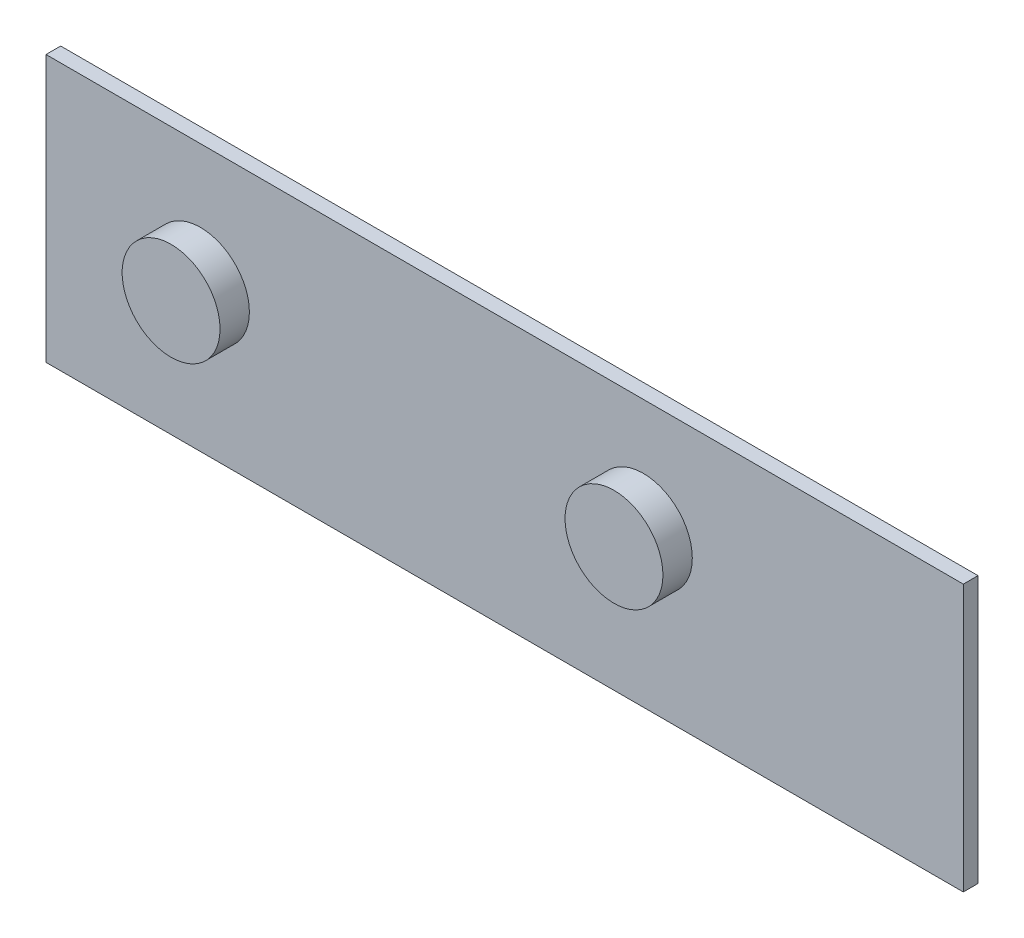
ISO-10303-21;
HEADER;
FILE_DESCRIPTION(('STEP AP214'),'2;1');
FILE_NAME('part.step','',(''),(''),'','','');
FILE_SCHEMA(('AUTOMOTIVE_DESIGN { 1 0 10303 214 1 1 1 1 }'));
ENDSEC;
DATA;
#1=APPLICATION_CONTEXT('core data for automotive mechanical design processes');
#2=APPLICATION_PROTOCOL_DEFINITION('international standard','automotive_design',2000,#1);
#3=PRODUCT_CONTEXT('',#1,'mechanical');
#4=PRODUCT('Part','Part','',(#3));
#5=PRODUCT_RELATED_PRODUCT_CATEGORY('part','',(#4));
#6=PRODUCT_DEFINITION_FORMATION('','',#4);
#7=PRODUCT_DEFINITION_CONTEXT('part definition',#1,'design');
#8=PRODUCT_DEFINITION('design','',#6,#7);
#9=PRODUCT_DEFINITION_SHAPE('','',#8);
#10=(LENGTH_UNIT() NAMED_UNIT(*) SI_UNIT(.MILLI.,.METRE.));
#11=(NAMED_UNIT(*) PLANE_ANGLE_UNIT() SI_UNIT($,.RADIAN.));
#12=(NAMED_UNIT(*) SI_UNIT($,.STERADIAN.) SOLID_ANGLE_UNIT());
#13=UNCERTAINTY_MEASURE_WITH_UNIT(LENGTH_MEASURE(1.E-05),#10,'distance_accuracy_value','');
#14=(GEOMETRIC_REPRESENTATION_CONTEXT(3) GLOBAL_UNCERTAINTY_ASSIGNED_CONTEXT((#13)) GLOBAL_UNIT_ASSIGNED_CONTEXT((#10,
#11,#12)) REPRESENTATION_CONTEXT('',''));
#15=CARTESIAN_POINT('',(0.,0.,0.));
#16=DIRECTION('',(0.,0.,1.));
#17=DIRECTION('',(1.,0.,0.));
#18=AXIS2_PLACEMENT_3D('',#15,#16,#17);
#19=CARTESIAN_POINT('',(-69.2097512876734,54.4834710743802,3.));
#20=DIRECTION('',(1.,0.,0.));
#21=DIRECTION('',(0.,0.,-1.));
#22=AXIS2_PLACEMENT_3D('',#19,#20,#21);
#23=PLANE('',#22);
#24=DIRECTION('',(0.,-1.,0.));
#25=VECTOR('',#24,1.);
#26=CARTESIAN_POINT('',(-69.2097512876734,54.4834710743802,0.));
#27=LINE('',#26,#25);
#28=CARTESIAN_POINT('',(-69.2097512876734,54.4834710743802,0.));
#29=VERTEX_POINT('',#28);
#30=CARTESIAN_POINT('',(-69.2097512876734,0.,0.));
#31=VERTEX_POINT('',#30);
#32=EDGE_CURVE('E98',#29,#31,#27,.T.);
#33=ORIENTED_EDGE('',*,*,#32,.T.);
#34=DIRECTION('',(0.,0.,-1.));
#35=VECTOR('',#34,1.);
#36=CARTESIAN_POINT('',(-69.2097512876734,0.,3.));
#37=LINE('',#36,#35);
#38=CARTESIAN_POINT('',(-69.2097512876734,0.,3.));
#39=VERTEX_POINT('',#38);
#40=EDGE_CURVE('E11',#39,#31,#37,.T.);
#41=ORIENTED_EDGE('',*,*,#40,.F.);
#42=DIRECTION('',(0.,-1.,0.));
#43=VECTOR('',#42,1.);
#44=CARTESIAN_POINT('',(-69.2097512876734,54.4834710743802,3.));
#45=LINE('',#44,#43);
#46=CARTESIAN_POINT('',(-69.2097512876734,54.4834710743802,3.));
#47=VERTEX_POINT('',#46);
#48=EDGE_CURVE('E86',#47,#39,#45,.T.);
#49=ORIENTED_EDGE('',*,*,#48,.F.);
#50=DIRECTION('',(0.,0.,-1.));
#51=VECTOR('',#50,1.);
#52=CARTESIAN_POINT('',(-69.2097512876734,54.4834710743802,3.));
#53=LINE('',#52,#51);
#54=EDGE_CURVE('E94',#47,#29,#53,.T.);
#55=ORIENTED_EDGE('',*,*,#54,.T.);
#56=EDGE_LOOP('',(#33,#41,#49,#55));
#57=FACE_BOUND('',#56,.T.);
#58=ADVANCED_FACE('F35',(#57),#23,.F.);
#59=CARTESIAN_POINT('',(-69.2097512876734,0.,3.));
#60=DIRECTION('',(0.,1.,0.));
#61=DIRECTION('',(0.,0.,1.));
#62=AXIS2_PLACEMENT_3D('',#59,#60,#61);
#63=PLANE('',#62);
#64=DIRECTION('',(1.,0.,0.));
#65=VECTOR('',#64,1.);
#66=CARTESIAN_POINT('',(-69.2097512876734,0.,0.));
#67=LINE('',#66,#65);
#68=CARTESIAN_POINT('',(118.228265241252,0.,0.));
#69=VERTEX_POINT('',#68);
#70=EDGE_CURVE('E90',#31,#69,#67,.T.);
#71=ORIENTED_EDGE('',*,*,#70,.T.);
#72=DIRECTION('',(0.,0.,-1.));
#73=VECTOR('',#72,1.);
#74=CARTESIAN_POINT('',(118.228265241252,0.,3.));
#75=LINE('',#74,#73);
#76=CARTESIAN_POINT('',(118.228265241252,0.,3.));
#77=VERTEX_POINT('',#76);
#78=EDGE_CURVE('E43',#77,#69,#75,.T.);
#79=ORIENTED_EDGE('',*,*,#78,.F.);
#80=DIRECTION('',(1.,0.,0.));
#81=VECTOR('',#80,1.);
#82=CARTESIAN_POINT('',(-69.2097512876734,0.,3.));
#83=LINE('',#82,#81);
#84=EDGE_CURVE('E81',#39,#77,#83,.T.);
#85=ORIENTED_EDGE('',*,*,#84,.F.);
#86=ORIENTED_EDGE('',*,*,#40,.T.);
#87=EDGE_LOOP('',(#71,#79,#85,#86));
#88=FACE_BOUND('',#87,.T.);
#89=ADVANCED_FACE('F89',(#88),#63,.F.);
#90=CARTESIAN_POINT('',(118.228265241252,54.4834710743802,3.));
#91=DIRECTION('',(-1.,0.,0.));
#92=DIRECTION('',(0.,0.,1.));
#93=AXIS2_PLACEMENT_3D('',#90,#91,#92);
#94=PLANE('',#93);
#95=DIRECTION('',(0.,1.,0.));
#96=VECTOR('',#95,1.);
#97=CARTESIAN_POINT('',(118.228265241252,54.4834710743802,0.));
#98=LINE('',#97,#96);
#99=CARTESIAN_POINT('',(118.228265241252,54.4834710743802,0.));
#100=VERTEX_POINT('',#99);
#101=EDGE_CURVE('E68',#69,#100,#98,.T.);
#102=ORIENTED_EDGE('',*,*,#101,.T.);
#103=DIRECTION('',(0.,0.,-1.));
#104=VECTOR('',#103,1.);
#105=CARTESIAN_POINT('',(118.228265241252,54.4834710743802,3.));
#106=LINE('',#105,#104);
#107=CARTESIAN_POINT('',(118.228265241252,54.4834710743802,3.));
#108=VERTEX_POINT('',#107);
#109=EDGE_CURVE('E91',#108,#100,#106,.T.);
#110=ORIENTED_EDGE('',*,*,#109,.F.);
#111=DIRECTION('',(0.,1.,0.));
#112=VECTOR('',#111,1.);
#113=CARTESIAN_POINT('',(118.228265241252,54.4834710743802,3.));
#114=LINE('',#113,#112);
#115=EDGE_CURVE('E84',#77,#108,#114,.T.);
#116=ORIENTED_EDGE('',*,*,#115,.F.);
#117=ORIENTED_EDGE('',*,*,#78,.T.);
#118=EDGE_LOOP('',(#102,#110,#116,#117));
#119=FACE_BOUND('',#118,.T.);
#120=ADVANCED_FACE('F92',(#119),#94,.F.);
#121=CARTESIAN_POINT('',(-69.2097512876734,54.4834710743802,3.));
#122=DIRECTION('',(0.,-1.,0.));
#123=DIRECTION('',(0.,0.,-1.));
#124=AXIS2_PLACEMENT_3D('',#121,#122,#123);
#125=PLANE('',#124);
#126=DIRECTION('',(-1.,0.,0.));
#127=VECTOR('',#126,1.);
#128=CARTESIAN_POINT('',(-69.2097512876734,54.4834710743802,0.));
#129=LINE('',#128,#127);
#130=EDGE_CURVE('E74',#100,#29,#129,.T.);
#131=ORIENTED_EDGE('',*,*,#130,.T.);
#132=ORIENTED_EDGE('',*,*,#54,.F.);
#133=DIRECTION('',(-1.,0.,0.));
#134=VECTOR('',#133,1.);
#135=CARTESIAN_POINT('',(-69.2097512876734,54.4834710743802,3.));
#136=LINE('',#135,#134);
#137=EDGE_CURVE('E51',#108,#47,#136,.T.);
#138=ORIENTED_EDGE('',*,*,#137,.F.);
#139=ORIENTED_EDGE('',*,*,#109,.T.);
#140=EDGE_LOOP('',(#131,#132,#138,#139));
#141=FACE_BOUND('',#140,.T.);
#142=ADVANCED_FACE('F106',(#141),#125,.F.);
#143=CARTESIAN_POINT('',(0.,0.,3.));
#144=DIRECTION('',(0.,0.,1.));
#145=DIRECTION('',(1.,0.,0.));
#146=AXIS2_PLACEMENT_3D('',#143,#144,#145);
#147=PLANE('',#146);
#148=CARTESIAN_POINT('',(52.8498703879021,31.39263346104,3.));
#149=DIRECTION('',(0.,0.,1.));
#150=DIRECTION('',(1.,0.,0.));
#151=AXIS2_PLACEMENT_3D('',#148,#149,#150);
#152=CIRCLE('',#151,9.99999999999999);
#153=CARTESIAN_POINT('',(62.8498703879021,31.39263346104,3.));
#154=VERTEX_POINT('',#153);
#155=EDGE_CURVE('E118',#154,#154,#152,.T.);
#156=ORIENTED_EDGE('',*,*,#155,.F.);
#157=EDGE_LOOP('',(#156));
#158=FACE_BOUND('',#157,.T.);
#159=CARTESIAN_POINT('',(-37.6501296120979,29.6750205270331,3.));
#160=DIRECTION('',(0.,0.,1.));
#161=DIRECTION('',(1.,0.,0.));
#162=AXIS2_PLACEMENT_3D('',#159,#160,#161);
#163=CIRCLE('',#162,10.);
#164=CARTESIAN_POINT('',(-27.6501296120979,29.6750205270331,3.));
#165=VERTEX_POINT('',#164);
#166=EDGE_CURVE('E112',#165,#165,#163,.T.);
#167=ORIENTED_EDGE('',*,*,#166,.F.);
#168=EDGE_LOOP('',(#167));
#169=FACE_BOUND('',#168,.T.);
#170=ORIENTED_EDGE('',*,*,#48,.T.);
#171=ORIENTED_EDGE('',*,*,#84,.T.);
#172=ORIENTED_EDGE('',*,*,#115,.T.);
#173=ORIENTED_EDGE('',*,*,#137,.T.);
#174=EDGE_LOOP('',(#170,#171,#172,#173));
#175=FACE_BOUND('',#174,.T.);
#176=ADVANCED_FACE('F82',(#158,#169,#175),#147,.T.);
#177=CARTESIAN_POINT('',(0.,0.,0.));
#178=DIRECTION('',(0.,0.,1.));
#179=DIRECTION('',(1.,0.,0.));
#180=AXIS2_PLACEMENT_3D('',#177,#178,#179);
#181=PLANE('',#180);
#182=ORIENTED_EDGE('',*,*,#32,.F.);
#183=ORIENTED_EDGE('',*,*,#130,.F.);
#184=ORIENTED_EDGE('',*,*,#101,.F.);
#185=ORIENTED_EDGE('',*,*,#70,.F.);
#186=EDGE_LOOP('',(#182,#183,#184,#185));
#187=FACE_BOUND('',#186,.T.);
#188=ADVANCED_FACE('F109',(#187),#181,.F.);
#189=CARTESIAN_POINT('',(-37.6501296120979,29.6750205270331,9.));
#190=DIRECTION('',(0.,0.,-1.));
#191=DIRECTION('',(-1.,0.,0.));
#192=AXIS2_PLACEMENT_3D('',#189,#190,#191);
#193=CYLINDRICAL_SURFACE('',#192,10.);
#194=CARTESIAN_POINT('',(-37.6501296120979,29.6750205270331,9.));
#195=DIRECTION('',(0.,0.,1.));
#196=DIRECTION('',(1.,0.,0.));
#197=AXIS2_PLACEMENT_3D('',#194,#195,#196);
#198=CIRCLE('',#197,10.);
#199=CARTESIAN_POINT('',(-27.6501296120979,29.6750205270331,9.));
#200=VERTEX_POINT('',#199);
#201=EDGE_CURVE('E101',#200,#200,#198,.T.);
#202=ORIENTED_EDGE('',*,*,#201,.F.);
#203=EDGE_LOOP('',(#202));
#204=FACE_BOUND('',#203,.T.);
#205=ORIENTED_EDGE('',*,*,#166,.T.);
#206=EDGE_LOOP('',(#205));
#207=FACE_BOUND('',#206,.T.);
#208=ADVANCED_FACE('F138',(#204,#207),#193,.T.);
#209=CARTESIAN_POINT('',(-37.6501296120979,29.6750205270331,9.));
#210=DIRECTION('',(0.,0.,1.));
#211=DIRECTION('',(1.,0.,0.));
#212=AXIS2_PLACEMENT_3D('',#209,#210,#211);
#213=PLANE('',#212);
#214=ORIENTED_EDGE('',*,*,#201,.T.);
#215=EDGE_LOOP('',(#214));
#216=FACE_BOUND('',#215,.T.);
#217=ADVANCED_FACE('F129',(#216),#213,.T.);
#218=CARTESIAN_POINT('',(52.8498703879021,31.39263346104,9.));
#219=DIRECTION('',(0.,0.,-1.));
#220=DIRECTION('',(-1.,0.,0.));
#221=AXIS2_PLACEMENT_3D('',#218,#219,#220);
#222=CYLINDRICAL_SURFACE('',#221,9.99999999999999);
#223=CARTESIAN_POINT('',(52.8498703879021,31.39263346104,9.));
#224=DIRECTION('',(0.,0.,1.));
#225=DIRECTION('',(1.,0.,0.));
#226=AXIS2_PLACEMENT_3D('',#223,#224,#225);
#227=CIRCLE('',#226,9.99999999999999);
#228=CARTESIAN_POINT('',(62.8498703879021,31.39263346104,9.));
#229=VERTEX_POINT('',#228);
#230=EDGE_CURVE('E115',#229,#229,#227,.T.);
#231=ORIENTED_EDGE('',*,*,#230,.F.);
#232=EDGE_LOOP('',(#231));
#233=FACE_BOUND('',#232,.T.);
#234=ORIENTED_EDGE('',*,*,#155,.T.);
#235=EDGE_LOOP('',(#234));
#236=FACE_BOUND('',#235,.T.);
#237=ADVANCED_FACE('F126',(#233,#236),#222,.T.);
#238=CARTESIAN_POINT('',(52.8498703879021,31.39263346104,9.));
#239=DIRECTION('',(0.,0.,1.));
#240=DIRECTION('',(1.,0.,0.));
#241=AXIS2_PLACEMENT_3D('',#238,#239,#240);
#242=PLANE('',#241);
#243=ORIENTED_EDGE('',*,*,#230,.T.);
#244=EDGE_LOOP('',(#243));
#245=FACE_BOUND('',#244,.T.);
#246=ADVANCED_FACE('F124',(#245),#242,.T.);
#247=CLOSED_SHELL('',(#58,#89,#120,#142,#176,#188,#208,#217,#237,#246));
#248=MANIFOLD_SOLID_BREP('B2',#247);
#249=ADVANCED_BREP_SHAPE_REPRESENTATION('',(#18,#248),#14);
#250=SHAPE_DEFINITION_REPRESENTATION(#9,#249);
ENDSEC;
END-ISO-10303-21;
